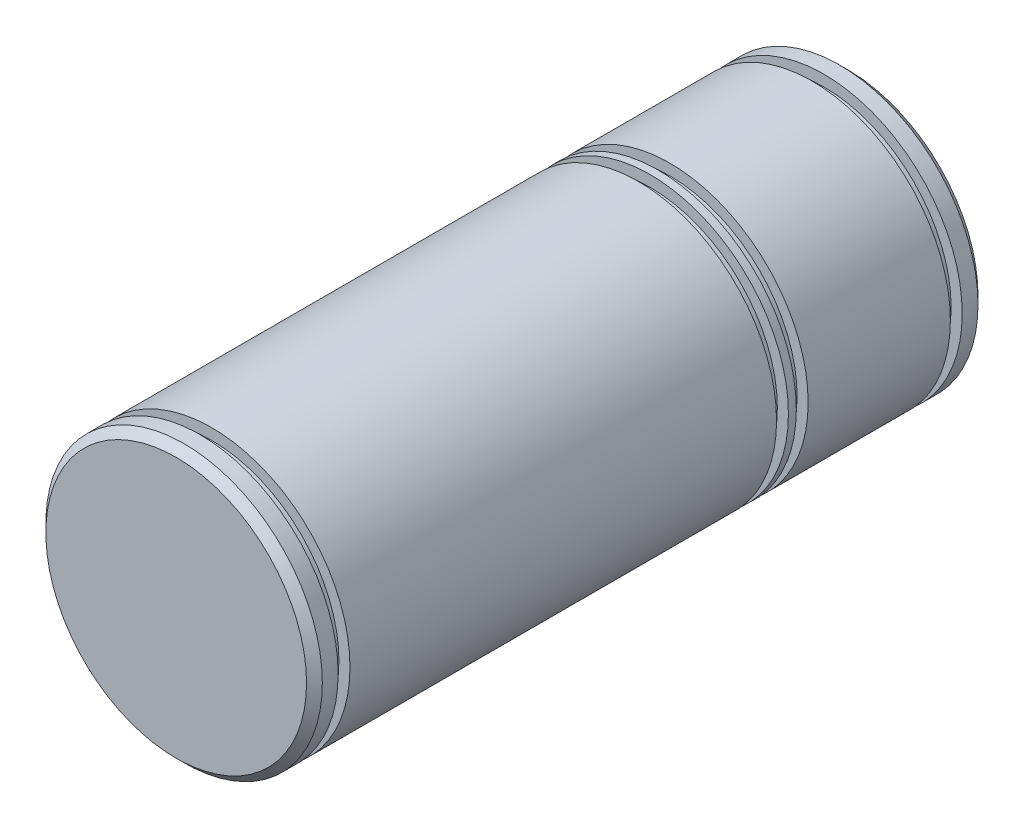
ISO-10303-21;
HEADER;
FILE_DESCRIPTION(('STEP AP214'),'2;1');
FILE_NAME('part.step','',(''),(''),'','','');
FILE_SCHEMA(('AUTOMOTIVE_DESIGN { 1 0 10303 214 1 1 1 1 }'));
ENDSEC;
DATA;
#1=APPLICATION_CONTEXT('core data for automotive mechanical design processes');
#2=APPLICATION_PROTOCOL_DEFINITION('international standard','automotive_design',2000,#1);
#3=PRODUCT_CONTEXT('',#1,'mechanical');
#4=PRODUCT('Part','Part','',(#3));
#5=PRODUCT_RELATED_PRODUCT_CATEGORY('part','',(#4));
#6=PRODUCT_DEFINITION_FORMATION('','',#4);
#7=PRODUCT_DEFINITION_CONTEXT('part definition',#1,'design');
#8=PRODUCT_DEFINITION('design','',#6,#7);
#9=PRODUCT_DEFINITION_SHAPE('','',#8);
#10=(LENGTH_UNIT() NAMED_UNIT(*) SI_UNIT(.MILLI.,.METRE.));
#11=(NAMED_UNIT(*) PLANE_ANGLE_UNIT() SI_UNIT($,.RADIAN.));
#12=(NAMED_UNIT(*) SI_UNIT($,.STERADIAN.) SOLID_ANGLE_UNIT());
#13=UNCERTAINTY_MEASURE_WITH_UNIT(LENGTH_MEASURE(1.E-05),#10,'distance_accuracy_value','');
#14=(GEOMETRIC_REPRESENTATION_CONTEXT(3) GLOBAL_UNCERTAINTY_ASSIGNED_CONTEXT((#13)) GLOBAL_UNIT_ASSIGNED_CONTEXT((#10,
#11,#12)) REPRESENTATION_CONTEXT('',''));
#15=CARTESIAN_POINT('',(0.,0.,0.));
#16=DIRECTION('',(0.,0.,1.));
#17=DIRECTION('',(1.,0.,0.));
#18=AXIS2_PLACEMENT_3D('',#15,#16,#17);
#19=CARTESIAN_POINT('',(0.,0.,85.));
#20=DIRECTION('',(0.,0.,-1.));
#21=DIRECTION('',(-1.,0.,0.));
#22=AXIS2_PLACEMENT_3D('',#19,#20,#21);
#23=CYLINDRICAL_SURFACE('',#22,17.5);
#24=CARTESIAN_POINT('',(0.,0.,1.00000000000004));
#25=DIRECTION('',(0.,0.,1.));
#26=DIRECTION('',(1.,0.,0.));
#27=AXIS2_PLACEMENT_3D('',#24,#25,#26);
#28=CIRCLE('',#27,17.5);
#29=CARTESIAN_POINT('',(17.5,0.,1.00000000000004));
#30=VERTEX_POINT('',#29);
#31=EDGE_CURVE('E53',#30,#30,#28,.T.);
#32=ORIENTED_EDGE('',*,*,#31,.T.);
#33=EDGE_LOOP('',(#32));
#34=FACE_BOUND('',#33,.T.);
#35=CARTESIAN_POINT('',(0.,0.,3.));
#36=DIRECTION('',(0.,0.,1.));
#37=DIRECTION('',(1.,0.,0.));
#38=AXIS2_PLACEMENT_3D('',#35,#36,#37);
#39=CIRCLE('',#38,17.5);
#40=CARTESIAN_POINT('',(17.5,0.,3.));
#41=VERTEX_POINT('',#40);
#42=EDGE_CURVE('E87',#41,#41,#39,.T.);
#43=ORIENTED_EDGE('',*,*,#42,.F.);
#44=EDGE_LOOP('',(#43));
#45=FACE_BOUND('',#44,.T.);
#46=ADVANCED_FACE('F37',(#34,#45),#23,.T.);
#47=CARTESIAN_POINT('',(0.,0.,0.));
#48=DIRECTION('',(0.,0.,1.));
#49=DIRECTION('',(1.,0.,0.));
#50=AXIS2_PLACEMENT_3D('',#47,#48,#49);
#51=PLANE('',#50);
#52=CARTESIAN_POINT('',(0.,0.,0.));
#53=DIRECTION('',(0.,0.,1.));
#54=DIRECTION('',(1.,0.,0.));
#55=AXIS2_PLACEMENT_3D('',#52,#53,#54);
#56=CIRCLE('',#55,16.5);
#57=CARTESIAN_POINT('',(16.5,0.,0.));
#58=VERTEX_POINT('',#57);
#59=EDGE_CURVE('E49',#58,#58,#56,.F.);
#60=ORIENTED_EDGE('',*,*,#59,.T.);
#61=EDGE_LOOP('',(#60));
#62=FACE_BOUND('',#61,.T.);
#63=ADVANCED_FACE('F111',(#62),#51,.F.);
#64=CARTESIAN_POINT('',(0.,17.5,3.));
#65=DIRECTION('',(0.,0.,1.));
#66=DIRECTION('',(1.,0.,0.));
#67=AXIS2_PLACEMENT_3D('',#64,#65,#66);
#68=PLANE('',#67);
#69=ORIENTED_EDGE('',*,*,#42,.T.);
#70=EDGE_LOOP('',(#69));
#71=FACE_BOUND('',#70,.T.);
#72=CARTESIAN_POINT('',(0.,0.,3.));
#73=DIRECTION('',(0.,0.,1.));
#74=DIRECTION('',(1.,0.,0.));
#75=AXIS2_PLACEMENT_3D('',#72,#73,#74);
#76=CIRCLE('',#75,16.1);
#77=CARTESIAN_POINT('',(16.1,0.,3.));
#78=VERTEX_POINT('',#77);
#79=EDGE_CURVE('E58',#78,#78,#76,.T.);
#80=ORIENTED_EDGE('',*,*,#79,.F.);
#81=EDGE_LOOP('',(#80));
#82=FACE_BOUND('',#81,.T.);
#83=ADVANCED_FACE('F107',(#71,#82),#68,.T.);
#84=CARTESIAN_POINT('',(0.,0.,85.));
#85=DIRECTION('',(0.,0.,1.));
#86=DIRECTION('',(1.,0.,0.));
#87=AXIS2_PLACEMENT_3D('',#84,#85,#86);
#88=CYLINDRICAL_SURFACE('',#87,16.1);
#89=ORIENTED_EDGE('',*,*,#79,.T.);
#90=EDGE_LOOP('',(#89));
#91=FACE_BOUND('',#90,.T.);
#92=CARTESIAN_POINT('',(0.,0.,4.5));
#93=DIRECTION('',(0.,0.,1.));
#94=DIRECTION('',(1.,0.,0.));
#95=AXIS2_PLACEMENT_3D('',#92,#93,#94);
#96=CIRCLE('',#95,16.1);
#97=CARTESIAN_POINT('',(16.1,0.,4.5));
#98=VERTEX_POINT('',#97);
#99=EDGE_CURVE('E98',#98,#98,#96,.T.);
#100=ORIENTED_EDGE('',*,*,#99,.F.);
#101=EDGE_LOOP('',(#100));
#102=FACE_BOUND('',#101,.T.);
#103=ADVANCED_FACE('F297',(#91,#102),#88,.T.);
#104=CARTESIAN_POINT('',(0.,17.5,4.5));
#105=DIRECTION('',(0.,0.,-1.));
#106=DIRECTION('',(-1.,0.,0.));
#107=AXIS2_PLACEMENT_3D('',#104,#105,#106);
#108=PLANE('',#107);
#109=ORIENTED_EDGE('',*,*,#99,.T.);
#110=EDGE_LOOP('',(#109));
#111=FACE_BOUND('',#110,.T.);
#112=CARTESIAN_POINT('',(0.,0.,4.5));
#113=DIRECTION('',(0.,0.,1.));
#114=DIRECTION('',(1.,0.,0.));
#115=AXIS2_PLACEMENT_3D('',#112,#113,#114);
#116=CIRCLE('',#115,17.5);
#117=CARTESIAN_POINT('',(17.5,0.,4.5));
#118=VERTEX_POINT('',#117);
#119=EDGE_CURVE('E101',#118,#118,#116,.T.);
#120=ORIENTED_EDGE('',*,*,#119,.F.);
#121=EDGE_LOOP('',(#120));
#122=FACE_BOUND('',#121,.T.);
#123=ADVANCED_FACE('F123',(#111,#122),#108,.T.);
#124=CARTESIAN_POINT('',(0.,0.,22.5));
#125=DIRECTION('',(0.,0.,1.));
#126=DIRECTION('',(1.,0.,0.));
#127=AXIS2_PLACEMENT_3D('',#124,#125,#126);
#128=CIRCLE('',#127,17.5);
#129=CARTESIAN_POINT('',(17.5,0.,22.5));
#130=VERTEX_POINT('',#129);
#131=EDGE_CURVE('E75',#130,#130,#128,.T.);
#132=ORIENTED_EDGE('',*,*,#131,.F.);
#133=EDGE_LOOP('',(#132));
#134=FACE_BOUND('',#133,.T.);
#135=ORIENTED_EDGE('',*,*,#119,.T.);
#136=EDGE_LOOP('',(#135));
#137=FACE_BOUND('',#136,.T.);
#138=ADVANCED_FACE('F114',(#134,#137),#23,.T.);
#139=CARTESIAN_POINT('',(0.,17.5,22.5));
#140=DIRECTION('',(0.,0.,1.));
#141=DIRECTION('',(1.,0.,0.));
#142=AXIS2_PLACEMENT_3D('',#139,#140,#141);
#143=PLANE('',#142);
#144=ORIENTED_EDGE('',*,*,#131,.T.);
#145=EDGE_LOOP('',(#144));
#146=FACE_BOUND('',#145,.T.);
#147=CARTESIAN_POINT('',(0.,0.,22.5));
#148=DIRECTION('',(0.,0.,1.));
#149=DIRECTION('',(1.,0.,0.));
#150=AXIS2_PLACEMENT_3D('',#147,#148,#149);
#151=CIRCLE('',#150,16.1);
#152=CARTESIAN_POINT('',(16.1,0.,22.5));
#153=VERTEX_POINT('',#152);
#154=EDGE_CURVE('E84',#153,#153,#151,.T.);
#155=ORIENTED_EDGE('',*,*,#154,.F.);
#156=EDGE_LOOP('',(#155));
#157=FACE_BOUND('',#156,.T.);
#158=ADVANCED_FACE('F122',(#146,#157),#143,.T.);
#159=CARTESIAN_POINT('',(0.,0.,85.));
#160=DIRECTION('',(0.,0.,1.));
#161=DIRECTION('',(1.,0.,0.));
#162=AXIS2_PLACEMENT_3D('',#159,#160,#161);
#163=CYLINDRICAL_SURFACE('',#162,16.1);
#164=ORIENTED_EDGE('',*,*,#154,.T.);
#165=EDGE_LOOP('',(#164));
#166=FACE_BOUND('',#165,.T.);
#167=CARTESIAN_POINT('',(0.,0.,24.));
#168=DIRECTION('',(0.,0.,1.));
#169=DIRECTION('',(1.,0.,0.));
#170=AXIS2_PLACEMENT_3D('',#167,#168,#169);
#171=CIRCLE('',#170,16.1);
#172=CARTESIAN_POINT('',(16.1,0.,24.));
#173=VERTEX_POINT('',#172);
#174=EDGE_CURVE('E88',#173,#173,#171,.T.);
#175=ORIENTED_EDGE('',*,*,#174,.F.);
#176=EDGE_LOOP('',(#175));
#177=FACE_BOUND('',#176,.T.);
#178=ADVANCED_FACE('F164',(#166,#177),#163,.T.);
#179=CARTESIAN_POINT('',(0.,17.5,24.));
#180=DIRECTION('',(0.,0.,-1.));
#181=DIRECTION('',(-1.,0.,0.));
#182=AXIS2_PLACEMENT_3D('',#179,#180,#181);
#183=PLANE('',#182);
#184=ORIENTED_EDGE('',*,*,#174,.T.);
#185=EDGE_LOOP('',(#184));
#186=FACE_BOUND('',#185,.T.);
#187=CARTESIAN_POINT('',(0.,0.,24.));
#188=DIRECTION('',(0.,0.,1.));
#189=DIRECTION('',(1.,0.,0.));
#190=AXIS2_PLACEMENT_3D('',#187,#188,#189);
#191=CIRCLE('',#190,17.5);
#192=CARTESIAN_POINT('',(17.5,0.,24.));
#193=VERTEX_POINT('',#192);
#194=EDGE_CURVE('E91',#193,#193,#191,.T.);
#195=ORIENTED_EDGE('',*,*,#194,.F.);
#196=EDGE_LOOP('',(#195));
#197=FACE_BOUND('',#196,.T.);
#198=ADVANCED_FACE('F156',(#186,#197),#183,.T.);
#199=CARTESIAN_POINT('',(0.,0.,25.));
#200=DIRECTION('',(0.,0.,1.));
#201=DIRECTION('',(1.,0.,0.));
#202=AXIS2_PLACEMENT_3D('',#199,#200,#201);
#203=CIRCLE('',#202,17.5);
#204=CARTESIAN_POINT('',(17.5,0.,25.));
#205=VERTEX_POINT('',#204);
#206=EDGE_CURVE('E62',#205,#205,#203,.T.);
#207=ORIENTED_EDGE('',*,*,#206,.F.);
#208=EDGE_LOOP('',(#207));
#209=FACE_BOUND('',#208,.T.);
#210=ORIENTED_EDGE('',*,*,#194,.T.);
#211=EDGE_LOOP('',(#210));
#212=FACE_BOUND('',#211,.T.);
#213=ADVANCED_FACE('F125',(#209,#212),#23,.T.);
#214=CARTESIAN_POINT('',(0.,17.5,25.));
#215=DIRECTION('',(0.,0.,1.));
#216=DIRECTION('',(1.,0.,0.));
#217=AXIS2_PLACEMENT_3D('',#214,#215,#216);
#218=PLANE('',#217);
#219=ORIENTED_EDGE('',*,*,#206,.T.);
#220=EDGE_LOOP('',(#219));
#221=FACE_BOUND('',#220,.T.);
#222=CARTESIAN_POINT('',(0.,0.,25.));
#223=DIRECTION('',(0.,0.,1.));
#224=DIRECTION('',(1.,0.,0.));
#225=AXIS2_PLACEMENT_3D('',#222,#223,#224);
#226=CIRCLE('',#225,16.1);
#227=CARTESIAN_POINT('',(16.1,0.,25.));
#228=VERTEX_POINT('',#227);
#229=EDGE_CURVE('E72',#228,#228,#226,.T.);
#230=ORIENTED_EDGE('',*,*,#229,.F.);
#231=EDGE_LOOP('',(#230));
#232=FACE_BOUND('',#231,.T.);
#233=ADVANCED_FACE('F155',(#221,#232),#218,.T.);
#234=CARTESIAN_POINT('',(0.,0.,85.));
#235=DIRECTION('',(0.,0.,1.));
#236=DIRECTION('',(1.,0.,0.));
#237=AXIS2_PLACEMENT_3D('',#234,#235,#236);
#238=CYLINDRICAL_SURFACE('',#237,16.1);
#239=ORIENTED_EDGE('',*,*,#229,.T.);
#240=EDGE_LOOP('',(#239));
#241=FACE_BOUND('',#240,.T.);
#242=CARTESIAN_POINT('',(0.,0.,26.5));
#243=DIRECTION('',(0.,0.,1.));
#244=DIRECTION('',(1.,0.,0.));
#245=AXIS2_PLACEMENT_3D('',#242,#243,#244);
#246=CIRCLE('',#245,16.1);
#247=CARTESIAN_POINT('',(16.1,0.,26.5));
#248=VERTEX_POINT('',#247);
#249=EDGE_CURVE('E76',#248,#248,#246,.T.);
#250=ORIENTED_EDGE('',*,*,#249,.F.);
#251=EDGE_LOOP('',(#250));
#252=FACE_BOUND('',#251,.T.);
#253=ADVANCED_FACE('F149',(#241,#252),#238,.T.);
#254=CARTESIAN_POINT('',(0.,17.5,26.5));
#255=DIRECTION('',(0.,0.,-1.));
#256=DIRECTION('',(-1.,0.,0.));
#257=AXIS2_PLACEMENT_3D('',#254,#255,#256);
#258=PLANE('',#257);
#259=ORIENTED_EDGE('',*,*,#249,.T.);
#260=EDGE_LOOP('',(#259));
#261=FACE_BOUND('',#260,.T.);
#262=CARTESIAN_POINT('',(0.,0.,26.5));
#263=DIRECTION('',(0.,0.,1.));
#264=DIRECTION('',(1.,0.,0.));
#265=AXIS2_PLACEMENT_3D('',#262,#263,#264);
#266=CIRCLE('',#265,17.5);
#267=CARTESIAN_POINT('',(17.5,0.,26.5));
#268=VERTEX_POINT('',#267);
#269=EDGE_CURVE('E79',#268,#268,#266,.T.);
#270=ORIENTED_EDGE('',*,*,#269,.F.);
#271=EDGE_LOOP('',(#270));
#272=FACE_BOUND('',#271,.T.);
#273=ADVANCED_FACE('F140',(#261,#272),#258,.T.);
#274=CARTESIAN_POINT('',(0.,0.,80.5));
#275=DIRECTION('',(0.,0.,1.));
#276=DIRECTION('',(1.,0.,0.));
#277=AXIS2_PLACEMENT_3D('',#274,#275,#276);
#278=CIRCLE('',#277,17.5);
#279=CARTESIAN_POINT('',(17.5,0.,80.5));
#280=VERTEX_POINT('',#279);
#281=EDGE_CURVE('E69',#280,#280,#278,.T.);
#282=ORIENTED_EDGE('',*,*,#281,.F.);
#283=EDGE_LOOP('',(#282));
#284=FACE_BOUND('',#283,.T.);
#285=ORIENTED_EDGE('',*,*,#269,.T.);
#286=EDGE_LOOP('',(#285));
#287=FACE_BOUND('',#286,.T.);
#288=ADVANCED_FACE('F129',(#284,#287),#23,.T.);
#289=CARTESIAN_POINT('',(0.,17.5,80.5));
#290=DIRECTION('',(0.,0.,1.));
#291=DIRECTION('',(1.,0.,0.));
#292=AXIS2_PLACEMENT_3D('',#289,#290,#291);
#293=PLANE('',#292);
#294=ORIENTED_EDGE('',*,*,#281,.T.);
#295=EDGE_LOOP('',(#294));
#296=FACE_BOUND('',#295,.T.);
#297=CARTESIAN_POINT('',(0.,0.,80.5));
#298=DIRECTION('',(0.,0.,1.));
#299=DIRECTION('',(1.,0.,0.));
#300=AXIS2_PLACEMENT_3D('',#297,#298,#299);
#301=CIRCLE('',#300,16.1);
#302=CARTESIAN_POINT('',(16.1,0.,80.5));
#303=VERTEX_POINT('',#302);
#304=EDGE_CURVE('E59',#303,#303,#301,.T.);
#305=ORIENTED_EDGE('',*,*,#304,.F.);
#306=EDGE_LOOP('',(#305));
#307=FACE_BOUND('',#306,.T.);
#308=ADVANCED_FACE('F139',(#296,#307),#293,.T.);
#309=CARTESIAN_POINT('',(0.,0.,85.));
#310=DIRECTION('',(0.,0.,1.));
#311=DIRECTION('',(1.,0.,0.));
#312=AXIS2_PLACEMENT_3D('',#309,#310,#311);
#313=CYLINDRICAL_SURFACE('',#312,16.1);
#314=ORIENTED_EDGE('',*,*,#304,.T.);
#315=EDGE_LOOP('',(#314));
#316=FACE_BOUND('',#315,.T.);
#317=CARTESIAN_POINT('',(0.,0.,82.));
#318=DIRECTION('',(0.,0.,1.));
#319=DIRECTION('',(1.,0.,0.));
#320=AXIS2_PLACEMENT_3D('',#317,#318,#319);
#321=CIRCLE('',#320,16.1);
#322=CARTESIAN_POINT('',(16.1,0.,82.));
#323=VERTEX_POINT('',#322);
#324=EDGE_CURVE('E63',#323,#323,#321,.T.);
#325=ORIENTED_EDGE('',*,*,#324,.F.);
#326=EDGE_LOOP('',(#325));
#327=FACE_BOUND('',#326,.T.);
#328=ADVANCED_FACE('F146',(#316,#327),#313,.T.);
#329=CARTESIAN_POINT('',(0.,17.5,82.));
#330=DIRECTION('',(0.,0.,-1.));
#331=DIRECTION('',(-1.,0.,0.));
#332=AXIS2_PLACEMENT_3D('',#329,#330,#331);
#333=PLANE('',#332);
#334=ORIENTED_EDGE('',*,*,#324,.T.);
#335=EDGE_LOOP('',(#334));
#336=FACE_BOUND('',#335,.T.);
#337=CARTESIAN_POINT('',(0.,0.,82.));
#338=DIRECTION('',(0.,0.,1.));
#339=DIRECTION('',(1.,0.,0.));
#340=AXIS2_PLACEMENT_3D('',#337,#338,#339);
#341=CIRCLE('',#340,17.5);
#342=CARTESIAN_POINT('',(17.5,0.,82.));
#343=VERTEX_POINT('',#342);
#344=EDGE_CURVE('E66',#343,#343,#341,.T.);
#345=ORIENTED_EDGE('',*,*,#344,.F.);
#346=EDGE_LOOP('',(#345));
#347=FACE_BOUND('',#346,.T.);
#348=ADVANCED_FACE('F135',(#336,#347),#333,.T.);
#349=CARTESIAN_POINT('',(0.,0.,85.));
#350=DIRECTION('',(0.,0.,1.));
#351=DIRECTION('',(1.,0.,0.));
#352=AXIS2_PLACEMENT_3D('',#349,#350,#351);
#353=PLANE('',#352);
#354=CARTESIAN_POINT('',(0.,0.,85.));
#355=DIRECTION('',(0.,0.,1.));
#356=DIRECTION('',(1.,0.,0.));
#357=AXIS2_PLACEMENT_3D('',#354,#355,#356);
#358=CIRCLE('',#357,16.5);
#359=CARTESIAN_POINT('',(16.5,0.,85.));
#360=VERTEX_POINT('',#359);
#361=EDGE_CURVE('E45',#360,#360,#358,.T.);
#362=ORIENTED_EDGE('',*,*,#361,.T.);
#363=EDGE_LOOP('',(#362));
#364=FACE_BOUND('',#363,.T.);
#365=ADVANCED_FACE('F128',(#364),#353,.T.);
#366=CARTESIAN_POINT('',(0.,0.,84.));
#367=DIRECTION('',(0.,0.,1.));
#368=DIRECTION('',(1.,0.,0.));
#369=AXIS2_PLACEMENT_3D('',#366,#367,#368);
#370=CIRCLE('',#369,17.5);
#371=CARTESIAN_POINT('',(17.5,0.,84.));
#372=VERTEX_POINT('',#371);
#373=EDGE_CURVE('E10',#372,#372,#370,.F.);
#374=ORIENTED_EDGE('',*,*,#373,.T.);
#375=EDGE_LOOP('',(#374));
#376=FACE_BOUND('',#375,.T.);
#377=ORIENTED_EDGE('',*,*,#344,.T.);
#378=EDGE_LOOP('',(#377));
#379=FACE_BOUND('',#378,.T.);
#380=ADVANCED_FACE('F115',(#376,#379),#23,.T.);
#381=CARTESIAN_POINT('',(0.,0.,1.00000000000004));
#382=DIRECTION('',(0.,0.,1.));
#383=DIRECTION('',(1.,0.,0.));
#384=AXIS2_PLACEMENT_3D('',#381,#382,#383);
#385=CONICAL_SURFACE('',#384,17.5,0.78539816339744);
#386=ORIENTED_EDGE('',*,*,#59,.F.);
#387=EDGE_LOOP('',(#386));
#388=FACE_BOUND('',#387,.T.);
#389=ORIENTED_EDGE('',*,*,#31,.F.);
#390=EDGE_LOOP('',(#389));
#391=FACE_BOUND('',#390,.T.);
#392=ADVANCED_FACE('F127',(#388,#391),#385,.T.);
#393=CARTESIAN_POINT('',(0.,0.,85.));
#394=DIRECTION('',(0.,0.,-1.));
#395=DIRECTION('',(-1.,0.,0.));
#396=AXIS2_PLACEMENT_3D('',#393,#394,#395);
#397=CONICAL_SURFACE('',#396,16.5,0.785398163397457);
#398=ORIENTED_EDGE('',*,*,#373,.F.);
#399=EDGE_LOOP('',(#398));
#400=FACE_BOUND('',#399,.T.);
#401=ORIENTED_EDGE('',*,*,#361,.F.);
#402=EDGE_LOOP('',(#401));
#403=FACE_BOUND('',#402,.T.);
#404=ADVANCED_FACE('F40',(#400,#403),#397,.T.);
#405=CLOSED_SHELL('',(#46,#63,#83,#103,#123,#138,#158,#178,#198,#213,#233,#253,#273,#288,#308,
#328,#348,#365,#380,#392,#404));
#406=MANIFOLD_SOLID_BREP('B2',#405);
#407=ADVANCED_BREP_SHAPE_REPRESENTATION('',(#18,#406),#14);
#408=SHAPE_DEFINITION_REPRESENTATION(#9,#407);
ENDSEC;
END-ISO-10303-21;
